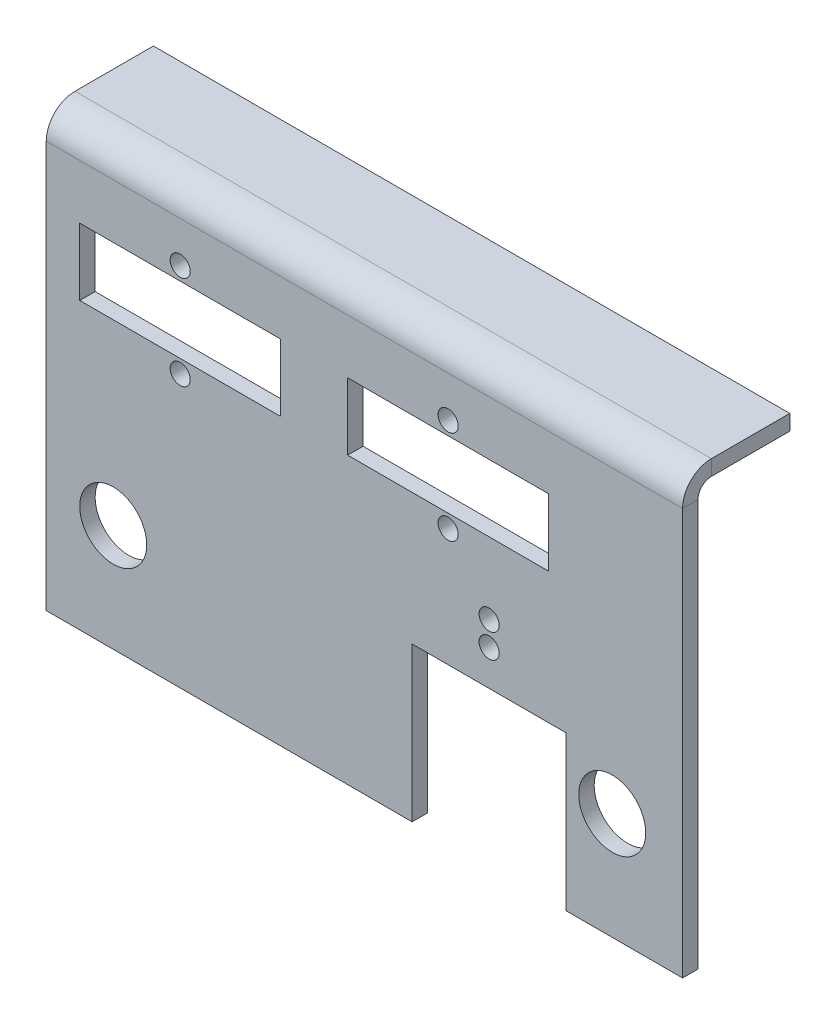
ISO-10303-21;
HEADER;
FILE_DESCRIPTION(('STEP AP214'),'2;1');
FILE_NAME('part.step','',(''),(''),'','','');
FILE_SCHEMA(('AUTOMOTIVE_DESIGN { 1 0 10303 214 1 1 1 1 }'));
ENDSEC;
DATA;
#1=APPLICATION_CONTEXT('core data for automotive mechanical design processes');
#2=APPLICATION_PROTOCOL_DEFINITION('international standard','automotive_design',2000,#1);
#3=PRODUCT_CONTEXT('',#1,'mechanical');
#4=PRODUCT('Part','Part','',(#3));
#5=PRODUCT_RELATED_PRODUCT_CATEGORY('part','',(#4));
#6=PRODUCT_DEFINITION_FORMATION('','',#4);
#7=PRODUCT_DEFINITION_CONTEXT('part definition',#1,'design');
#8=PRODUCT_DEFINITION('design','',#6,#7);
#9=PRODUCT_DEFINITION_SHAPE('','',#8);
#10=(LENGTH_UNIT() NAMED_UNIT(*) SI_UNIT(.MILLI.,.METRE.));
#11=(NAMED_UNIT(*) PLANE_ANGLE_UNIT() SI_UNIT($,.RADIAN.));
#12=(NAMED_UNIT(*) SI_UNIT($,.STERADIAN.) SOLID_ANGLE_UNIT());
#13=UNCERTAINTY_MEASURE_WITH_UNIT(LENGTH_MEASURE(1.E-05),#10,'distance_accuracy_value','');
#14=(GEOMETRIC_REPRESENTATION_CONTEXT(3) GLOBAL_UNCERTAINTY_ASSIGNED_CONTEXT((#13)) GLOBAL_UNIT_ASSIGNED_CONTEXT((#10,
#11,#12)) REPRESENTATION_CONTEXT('',''));
#15=CARTESIAN_POINT('',(0.,0.,0.));
#16=DIRECTION('',(0.,0.,1.));
#17=DIRECTION('',(1.,0.,0.));
#18=AXIS2_PLACEMENT_3D('',#15,#16,#17);
#19=CARTESIAN_POINT('',(0.,0.,-2.3));
#20=DIRECTION('',(0.,-1.,0.));
#21=DIRECTION('',(0.,0.,-1.));
#22=AXIS2_PLACEMENT_3D('',#19,#20,#21);
#23=PLANE('',#22);
#24=DIRECTION('',(0.,0.,1.));
#25=VECTOR('',#24,1.);
#26=CARTESIAN_POINT('',(54.62,0.,-16.001));
#27=LINE('',#26,#25);
#28=CARTESIAN_POINT('',(54.62,0.,-2.3));
#29=VERTEX_POINT('',#28);
#30=CARTESIAN_POINT('',(54.62,0.,0.));
#31=VERTEX_POINT('',#30);
#32=EDGE_CURVE('E292',#29,#31,#27,.T.);
#33=ORIENTED_EDGE('',*,*,#32,.T.);
#34=DIRECTION('',(1.,0.,0.));
#35=VECTOR('',#34,1.);
#36=CARTESIAN_POINT('',(0.,0.,0.));
#37=LINE('',#36,#35);
#38=CARTESIAN_POINT('',(0.,0.,0.));
#39=VERTEX_POINT('',#38);
#40=EDGE_CURVE('E378',#39,#31,#37,.T.);
#41=ORIENTED_EDGE('',*,*,#40,.F.);
#42=DIRECTION('',(0.,0.,1.));
#43=VECTOR('',#42,1.);
#44=CARTESIAN_POINT('',(0.,0.,-2.3));
#45=LINE('',#44,#43);
#46=CARTESIAN_POINT('',(0.,0.,-2.3));
#47=VERTEX_POINT('',#46);
#48=EDGE_CURVE('E65',#47,#39,#45,.T.);
#49=ORIENTED_EDGE('',*,*,#48,.F.);
#50=DIRECTION('',(1.,0.,0.));
#51=VECTOR('',#50,1.);
#52=CARTESIAN_POINT('',(0.,0.,-2.3));
#53=LINE('',#52,#51);
#54=EDGE_CURVE('E370',#47,#29,#53,.T.);
#55=ORIENTED_EDGE('',*,*,#54,.T.);
#56=EDGE_LOOP('',(#33,#41,#49,#55));
#57=FACE_BOUND('',#56,.T.);
#58=ADVANCED_FACE('F61',(#57),#23,.T.);
#59=CARTESIAN_POINT('',(95.,0.,-2.3));
#60=DIRECTION('',(1.,0.,0.));
#61=DIRECTION('',(0.,0.,-1.));
#62=AXIS2_PLACEMENT_3D('',#59,#60,#61);
#63=PLANE('',#62);
#64=DIRECTION('',(0.,1.,0.));
#65=VECTOR('',#64,1.);
#66=CARTESIAN_POINT('',(95.,0.,-2.3));
#67=LINE('',#66,#65);
#68=CARTESIAN_POINT('',(95.,0.,-2.3));
#69=VERTEX_POINT('',#68);
#70=CARTESIAN_POINT('',(95.,60.7,-2.3));
#71=VERTEX_POINT('',#70);
#72=EDGE_CURVE('E373',#69,#71,#67,.T.);
#73=ORIENTED_EDGE('',*,*,#72,.T.);
#74=DIRECTION('',(0.,0.,1.));
#75=VECTOR('',#74,1.);
#76=CARTESIAN_POINT('',(95.,60.7,-2.29999999999999));
#77=LINE('',#76,#75);
#78=CARTESIAN_POINT('',(95.,60.7,0.));
#79=VERTEX_POINT('',#78);
#80=EDGE_CURVE('E350',#71,#79,#77,.T.);
#81=ORIENTED_EDGE('',*,*,#80,.T.);
#82=DIRECTION('',(0.,1.,0.));
#83=VECTOR('',#82,1.);
#84=CARTESIAN_POINT('',(95.,0.,0.));
#85=LINE('',#84,#83);
#86=CARTESIAN_POINT('',(95.,0.,0.));
#87=VERTEX_POINT('',#86);
#88=EDGE_CURVE('E369',#87,#79,#85,.T.);
#89=ORIENTED_EDGE('',*,*,#88,.F.);
#90=DIRECTION('',(0.,0.,1.));
#91=VECTOR('',#90,1.);
#92=CARTESIAN_POINT('',(95.,0.,-2.3));
#93=LINE('',#92,#91);
#94=EDGE_CURVE('E13',#69,#87,#93,.T.);
#95=ORIENTED_EDGE('',*,*,#94,.F.);
#96=EDGE_LOOP('',(#73,#81,#89,#95));
#97=FACE_BOUND('',#96,.T.);
#98=ADVANCED_FACE('F432',(#97),#63,.T.);
#99=CARTESIAN_POINT('',(0.,0.,-2.3));
#100=DIRECTION('',(0.,0.,-1.));
#101=DIRECTION('',(-1.,0.,0.));
#102=AXIS2_PLACEMENT_3D('',#99,#100,#101);
#103=PLANE('',#102);
#104=CARTESIAN_POINT('',(10.,16.,-2.3));
#105=DIRECTION('',(0.,0.,-1.));
#106=DIRECTION('',(-1.,0.,0.));
#107=AXIS2_PLACEMENT_3D('',#104,#105,#106);
#108=CIRCLE('',#107,5.);
#109=CARTESIAN_POINT('',(5.,16.,-2.3));
#110=VERTEX_POINT('',#109);
#111=EDGE_CURVE('E707',#110,#110,#108,.T.);
#112=ORIENTED_EDGE('',*,*,#111,.F.);
#113=EDGE_LOOP('',(#112));
#114=FACE_BOUND('',#113,.T.);
#115=CARTESIAN_POINT('',(84.5,16.,-2.3));
#116=DIRECTION('',(0.,0.,-1.));
#117=DIRECTION('',(-1.,0.,0.));
#118=AXIS2_PLACEMENT_3D('',#115,#116,#117);
#119=CIRCLE('',#118,5.);
#120=CARTESIAN_POINT('',(79.5,16.,-2.3));
#121=VERTEX_POINT('',#120);
#122=EDGE_CURVE('E718',#121,#121,#119,.T.);
#123=ORIENTED_EDGE('',*,*,#122,.F.);
#124=EDGE_LOOP('',(#123));
#125=FACE_BOUND('',#124,.T.);
#126=CARTESIAN_POINT('',(20.,54.6,-2.3));
#127=DIRECTION('',(0.,0.,-1.));
#128=DIRECTION('',(-1.,0.,0.));
#129=AXIS2_PLACEMENT_3D('',#126,#127,#128);
#130=CIRCLE('',#129,1.49999999999994);
#131=CARTESIAN_POINT('',(18.5,54.6,-2.3));
#132=VERTEX_POINT('',#131);
#133=EDGE_CURVE('E725',#132,#132,#130,.T.);
#134=ORIENTED_EDGE('',*,*,#133,.F.);
#135=EDGE_LOOP('',(#134));
#136=FACE_BOUND('',#135,.T.);
#137=CARTESIAN_POINT('',(60.,40.6,-2.3));
#138=DIRECTION('',(0.,0.,-1.));
#139=DIRECTION('',(-1.,0.,0.));
#140=AXIS2_PLACEMENT_3D('',#137,#138,#139);
#141=CIRCLE('',#140,1.5);
#142=CARTESIAN_POINT('',(58.5,40.6,-2.3));
#143=VERTEX_POINT('',#142);
#144=EDGE_CURVE('E726',#143,#143,#141,.T.);
#145=ORIENTED_EDGE('',*,*,#144,.F.);
#146=EDGE_LOOP('',(#145));
#147=FACE_BOUND('',#146,.T.);
#148=CARTESIAN_POINT('',(60.,54.6,-2.3));
#149=DIRECTION('',(0.,0.,-1.));
#150=DIRECTION('',(-1.,0.,0.));
#151=AXIS2_PLACEMENT_3D('',#148,#149,#150);
#152=CIRCLE('',#151,1.5);
#153=CARTESIAN_POINT('',(58.5,54.6,-2.3));
#154=VERTEX_POINT('',#153);
#155=EDGE_CURVE('E238',#154,#154,#152,.T.);
#156=ORIENTED_EDGE('',*,*,#155,.F.);
#157=EDGE_LOOP('',(#156));
#158=FACE_BOUND('',#157,.T.);
#159=DIRECTION('',(0.,-1.,0.));
#160=VECTOR('',#159,1.);
#161=CARTESIAN_POINT('',(75.,52.6,-2.3));
#162=LINE('',#161,#160);
#163=CARTESIAN_POINT('',(75.,52.6,-2.3));
#164=VERTEX_POINT('',#163);
#165=CARTESIAN_POINT('',(75.,42.6,-2.3));
#166=VERTEX_POINT('',#165);
#167=EDGE_CURVE('E76',#164,#166,#162,.T.);
#168=ORIENTED_EDGE('',*,*,#167,.F.);
#169=DIRECTION('',(1.,0.,0.));
#170=VECTOR('',#169,1.);
#171=CARTESIAN_POINT('',(75.,52.6,-2.3));
#172=LINE('',#171,#170);
#173=CARTESIAN_POINT('',(45.,52.6,-2.3));
#174=VERTEX_POINT('',#173);
#175=EDGE_CURVE('E206',#174,#164,#172,.T.);
#176=ORIENTED_EDGE('',*,*,#175,.F.);
#177=DIRECTION('',(0.,1.,0.));
#178=VECTOR('',#177,1.);
#179=CARTESIAN_POINT('',(45.,52.6,-2.3));
#180=LINE('',#179,#178);
#181=CARTESIAN_POINT('',(45.,42.6,-2.3));
#182=VERTEX_POINT('',#181);
#183=EDGE_CURVE('E229',#182,#174,#180,.T.);
#184=ORIENTED_EDGE('',*,*,#183,.F.);
#185=DIRECTION('',(-1.,0.,0.));
#186=VECTOR('',#185,1.);
#187=CARTESIAN_POINT('',(75.,42.6,-2.3));
#188=LINE('',#187,#186);
#189=EDGE_CURVE('E222',#166,#182,#188,.T.);
#190=ORIENTED_EDGE('',*,*,#189,.F.);
#191=EDGE_LOOP('',(#168,#176,#184,#190));
#192=FACE_BOUND('',#191,.T.);
#193=CARTESIAN_POINT('',(20.,40.6,-2.3));
#194=DIRECTION('',(0.,0.,-1.));
#195=DIRECTION('',(-1.,0.,0.));
#196=AXIS2_PLACEMENT_3D('',#193,#194,#195);
#197=CIRCLE('',#196,1.49999999999998);
#198=CARTESIAN_POINT('',(18.5,40.6,-2.3));
#199=VERTEX_POINT('',#198);
#200=EDGE_CURVE('E710',#199,#199,#197,.T.);
#201=ORIENTED_EDGE('',*,*,#200,.F.);
#202=EDGE_LOOP('',(#201));
#203=FACE_BOUND('',#202,.T.);
#204=DIRECTION('',(0.,-1.,0.));
#205=VECTOR('',#204,1.);
#206=CARTESIAN_POINT('',(35.,52.6,-2.3));
#207=LINE('',#206,#205);
#208=CARTESIAN_POINT('',(35.,52.6,-2.3));
#209=VERTEX_POINT('',#208);
#210=CARTESIAN_POINT('',(35.,42.6,-2.3));
#211=VERTEX_POINT('',#210);
#212=EDGE_CURVE('E84',#209,#211,#207,.T.);
#213=ORIENTED_EDGE('',*,*,#212,.F.);
#214=DIRECTION('',(1.,0.,0.));
#215=VECTOR('',#214,1.);
#216=CARTESIAN_POINT('',(35.,52.6,-2.3));
#217=LINE('',#216,#215);
#218=CARTESIAN_POINT('',(5.,52.6,-2.3));
#219=VERTEX_POINT('',#218);
#220=EDGE_CURVE('E259',#219,#209,#217,.T.);
#221=ORIENTED_EDGE('',*,*,#220,.F.);
#222=DIRECTION('',(0.,1.,0.));
#223=VECTOR('',#222,1.);
#224=CARTESIAN_POINT('',(5.,52.6,-2.3));
#225=LINE('',#224,#223);
#226=CARTESIAN_POINT('',(5.,42.6,-2.3));
#227=VERTEX_POINT('',#226);
#228=EDGE_CURVE('E256',#227,#219,#225,.T.);
#229=ORIENTED_EDGE('',*,*,#228,.F.);
#230=DIRECTION('',(-1.,0.,0.));
#231=VECTOR('',#230,1.);
#232=CARTESIAN_POINT('',(35.,42.6,-2.3));
#233=LINE('',#232,#231);
#234=EDGE_CURVE('E253',#211,#227,#233,.T.);
#235=ORIENTED_EDGE('',*,*,#234,.F.);
#236=EDGE_LOOP('',(#213,#221,#229,#235));
#237=FACE_BOUND('',#236,.T.);
#238=DIRECTION('',(0.,-1.,0.));
#239=VECTOR('',#238,1.);
#240=CARTESIAN_POINT('',(54.62,0.,-2.3));
#241=LINE('',#240,#239);
#242=CARTESIAN_POINT('',(54.62,23.,-2.3));
#243=VERTEX_POINT('',#242);
#244=EDGE_CURVE('E281',#243,#29,#241,.T.);
#245=ORIENTED_EDGE('',*,*,#244,.T.);
#246=ORIENTED_EDGE('',*,*,#54,.F.);
#247=DIRECTION('',(0.,-1.,0.));
#248=VECTOR('',#247,1.);
#249=CARTESIAN_POINT('',(0.,0.,-2.3));
#250=LINE('',#249,#248);
#251=CARTESIAN_POINT('',(0.,60.7,-2.3));
#252=VERTEX_POINT('',#251);
#253=EDGE_CURVE('E366',#252,#47,#250,.T.);
#254=ORIENTED_EDGE('',*,*,#253,.F.);
#255=DIRECTION('',(1.,0.,0.));
#256=VECTOR('',#255,1.);
#257=CARTESIAN_POINT('',(95.,60.7,-2.29999999999999));
#258=LINE('',#257,#256);
#259=EDGE_CURVE('E356',#71,#252,#258,.F.);
#260=ORIENTED_EDGE('',*,*,#259,.F.);
#261=ORIENTED_EDGE('',*,*,#72,.F.);
#262=CARTESIAN_POINT('',(77.62,0.,-2.3));
#263=VERTEX_POINT('',#262);
#264=EDGE_CURVE('E368',#263,#69,#53,.T.);
#265=ORIENTED_EDGE('',*,*,#264,.F.);
#266=DIRECTION('',(0.,1.,0.));
#267=VECTOR('',#266,1.);
#268=CARTESIAN_POINT('',(77.62,0.,-2.3));
#269=LINE('',#268,#267);
#270=CARTESIAN_POINT('',(77.62,23.,-2.3));
#271=VERTEX_POINT('',#270);
#272=EDGE_CURVE('E274',#263,#271,#269,.T.);
#273=ORIENTED_EDGE('',*,*,#272,.T.);
#274=DIRECTION('',(-1.,0.,0.));
#275=VECTOR('',#274,1.);
#276=CARTESIAN_POINT('',(54.62,23.,-2.3));
#277=LINE('',#276,#275);
#278=EDGE_CURVE('E277',#271,#243,#277,.T.);
#279=ORIENTED_EDGE('',*,*,#278,.T.);
#280=EDGE_LOOP('',(#245,#246,#254,#260,#261,#265,#273,#279));
#281=FACE_BOUND('',#280,.T.);
#282=CARTESIAN_POINT('',(66.12,28.3,-2.3));
#283=DIRECTION('',(0.,0.,-1.));
#284=DIRECTION('',(-1.,0.,0.));
#285=AXIS2_PLACEMENT_3D('',#282,#283,#284);
#286=CIRCLE('',#285,1.5);
#287=CARTESIAN_POINT('',(64.62,28.3,-2.3));
#288=VERTEX_POINT('',#287);
#289=EDGE_CURVE('E304',#288,#288,#286,.F.);
#290=ORIENTED_EDGE('',*,*,#289,.T.);
#291=EDGE_LOOP('',(#290));
#292=FACE_BOUND('',#291,.T.);
#293=CARTESIAN_POINT('',(66.12,31.9,-2.3));
#294=DIRECTION('',(0.,0.,-1.));
#295=DIRECTION('',(-1.,0.,0.));
#296=AXIS2_PLACEMENT_3D('',#293,#294,#295);
#297=CIRCLE('',#296,1.5);
#298=CARTESIAN_POINT('',(64.62,31.9,-2.3));
#299=VERTEX_POINT('',#298);
#300=EDGE_CURVE('E273',#299,#299,#297,.F.);
#301=ORIENTED_EDGE('',*,*,#300,.T.);
#302=EDGE_LOOP('',(#301));
#303=FACE_BOUND('',#302,.T.);
#304=ADVANCED_FACE('F439',(#114,#125,#136,#147,#158,#192,#203,#237,#281,#292,#303),#103,.T.);
#305=CARTESIAN_POINT('',(0.,0.,0.));
#306=DIRECTION('',(0.,0.,-1.));
#307=DIRECTION('',(-1.,0.,0.));
#308=AXIS2_PLACEMENT_3D('',#305,#306,#307);
#309=PLANE('',#308);
#310=CARTESIAN_POINT('',(10.,16.,0.));
#311=DIRECTION('',(0.,0.,-1.));
#312=DIRECTION('',(-1.,0.,0.));
#313=AXIS2_PLACEMENT_3D('',#310,#311,#312);
#314=CIRCLE('',#313,5.);
#315=CARTESIAN_POINT('',(5.,16.,0.));
#316=VERTEX_POINT('',#315);
#317=EDGE_CURVE('E709',#316,#316,#314,.F.);
#318=ORIENTED_EDGE('',*,*,#317,.F.);
#319=EDGE_LOOP('',(#318));
#320=FACE_BOUND('',#319,.T.);
#321=CARTESIAN_POINT('',(84.5,16.,0.));
#322=DIRECTION('',(0.,0.,-1.));
#323=DIRECTION('',(-1.,0.,0.));
#324=AXIS2_PLACEMENT_3D('',#321,#322,#323);
#325=CIRCLE('',#324,5.);
#326=CARTESIAN_POINT('',(79.5,16.,0.));
#327=VERTEX_POINT('',#326);
#328=EDGE_CURVE('E715',#327,#327,#325,.F.);
#329=ORIENTED_EDGE('',*,*,#328,.F.);
#330=EDGE_LOOP('',(#329));
#331=FACE_BOUND('',#330,.T.);
#332=CARTESIAN_POINT('',(20.,54.6,0.));
#333=DIRECTION('',(0.,0.,-1.));
#334=DIRECTION('',(-1.,0.,0.));
#335=AXIS2_PLACEMENT_3D('',#332,#333,#334);
#336=CIRCLE('',#335,1.49999999999994);
#337=CARTESIAN_POINT('',(18.5,54.6,0.));
#338=VERTEX_POINT('',#337);
#339=EDGE_CURVE('E729',#338,#338,#336,.F.);
#340=ORIENTED_EDGE('',*,*,#339,.F.);
#341=EDGE_LOOP('',(#340));
#342=FACE_BOUND('',#341,.T.);
#343=CARTESIAN_POINT('',(60.,40.6,0.));
#344=DIRECTION('',(0.,0.,-1.));
#345=DIRECTION('',(-1.,0.,0.));
#346=AXIS2_PLACEMENT_3D('',#343,#344,#345);
#347=CIRCLE('',#346,1.5);
#348=CARTESIAN_POINT('',(58.5,40.6,0.));
#349=VERTEX_POINT('',#348);
#350=EDGE_CURVE('E242',#349,#349,#347,.F.);
#351=ORIENTED_EDGE('',*,*,#350,.F.);
#352=EDGE_LOOP('',(#351));
#353=FACE_BOUND('',#352,.T.);
#354=CARTESIAN_POINT('',(60.,54.6,0.));
#355=DIRECTION('',(0.,0.,-1.));
#356=DIRECTION('',(-1.,0.,0.));
#357=AXIS2_PLACEMENT_3D('',#354,#355,#356);
#358=CIRCLE('',#357,1.5);
#359=CARTESIAN_POINT('',(58.5,54.6,0.));
#360=VERTEX_POINT('',#359);
#361=EDGE_CURVE('E241',#360,#360,#358,.F.);
#362=ORIENTED_EDGE('',*,*,#361,.F.);
#363=EDGE_LOOP('',(#362));
#364=FACE_BOUND('',#363,.T.);
#365=DIRECTION('',(-1.,0.,0.));
#366=VECTOR('',#365,1.);
#367=CARTESIAN_POINT('',(75.,52.6,0.));
#368=LINE('',#367,#366);
#369=CARTESIAN_POINT('',(75.,52.6,0.));
#370=VERTEX_POINT('',#369);
#371=CARTESIAN_POINT('',(45.,52.6,0.));
#372=VERTEX_POINT('',#371);
#373=EDGE_CURVE('E220',#370,#372,#368,.T.);
#374=ORIENTED_EDGE('',*,*,#373,.F.);
#375=DIRECTION('',(0.,1.,0.));
#376=VECTOR('',#375,1.);
#377=CARTESIAN_POINT('',(75.,52.6,0.));
#378=LINE('',#377,#376);
#379=CARTESIAN_POINT('',(75.,42.6,0.));
#380=VERTEX_POINT('',#379);
#381=EDGE_CURVE('E200',#380,#370,#378,.T.);
#382=ORIENTED_EDGE('',*,*,#381,.F.);
#383=DIRECTION('',(1.,0.,0.));
#384=VECTOR('',#383,1.);
#385=CARTESIAN_POINT('',(75.,42.6,0.));
#386=LINE('',#385,#384);
#387=CARTESIAN_POINT('',(45.,42.6,0.));
#388=VERTEX_POINT('',#387);
#389=EDGE_CURVE('E210',#388,#380,#386,.T.);
#390=ORIENTED_EDGE('',*,*,#389,.F.);
#391=DIRECTION('',(0.,-1.,0.));
#392=VECTOR('',#391,1.);
#393=CARTESIAN_POINT('',(45.,52.6,0.));
#394=LINE('',#393,#392);
#395=EDGE_CURVE('E224',#372,#388,#394,.T.);
#396=ORIENTED_EDGE('',*,*,#395,.F.);
#397=EDGE_LOOP('',(#374,#382,#390,#396));
#398=FACE_BOUND('',#397,.T.);
#399=CARTESIAN_POINT('',(20.,40.6,0.));
#400=DIRECTION('',(0.,0.,-1.));
#401=DIRECTION('',(-1.,0.,0.));
#402=AXIS2_PLACEMENT_3D('',#399,#400,#401);
#403=CIRCLE('',#402,1.49999999999998);
#404=CARTESIAN_POINT('',(18.5,40.6,0.));
#405=VERTEX_POINT('',#404);
#406=EDGE_CURVE('E713',#405,#405,#403,.F.);
#407=ORIENTED_EDGE('',*,*,#406,.F.);
#408=EDGE_LOOP('',(#407));
#409=FACE_BOUND('',#408,.T.);
#410=DIRECTION('',(-1.,0.,0.));
#411=VECTOR('',#410,1.);
#412=CARTESIAN_POINT('',(35.,52.6,0.));
#413=LINE('',#412,#411);
#414=CARTESIAN_POINT('',(35.,52.6,0.));
#415=VERTEX_POINT('',#414);
#416=CARTESIAN_POINT('',(5.,52.6,0.));
#417=VERTEX_POINT('',#416);
#418=EDGE_CURVE('E246',#415,#417,#413,.T.);
#419=ORIENTED_EDGE('',*,*,#418,.F.);
#420=DIRECTION('',(0.,1.,0.));
#421=VECTOR('',#420,1.);
#422=CARTESIAN_POINT('',(35.,52.6,0.));
#423=LINE('',#422,#421);
#424=CARTESIAN_POINT('',(35.,42.6,0.));
#425=VERTEX_POINT('',#424);
#426=EDGE_CURVE('E249',#425,#415,#423,.T.);
#427=ORIENTED_EDGE('',*,*,#426,.F.);
#428=DIRECTION('',(1.,0.,0.));
#429=VECTOR('',#428,1.);
#430=CARTESIAN_POINT('',(35.,42.6,0.));
#431=LINE('',#430,#429);
#432=CARTESIAN_POINT('',(5.,42.6,0.));
#433=VERTEX_POINT('',#432);
#434=EDGE_CURVE('E265',#433,#425,#431,.T.);
#435=ORIENTED_EDGE('',*,*,#434,.F.);
#436=DIRECTION('',(0.,-1.,0.));
#437=VECTOR('',#436,1.);
#438=CARTESIAN_POINT('',(5.,52.6,0.));
#439=LINE('',#438,#437);
#440=EDGE_CURVE('E214',#417,#433,#439,.T.);
#441=ORIENTED_EDGE('',*,*,#440,.F.);
#442=EDGE_LOOP('',(#419,#427,#435,#441));
#443=FACE_BOUND('',#442,.T.);
#444=CARTESIAN_POINT('',(66.12,28.3,0.));
#445=DIRECTION('',(0.,0.,1.));
#446=DIRECTION('',(1.,0.,0.));
#447=AXIS2_PLACEMENT_3D('',#444,#445,#446);
#448=CIRCLE('',#447,1.5);
#449=CARTESIAN_POINT('',(67.62,28.3,0.));
#450=VERTEX_POINT('',#449);
#451=EDGE_CURVE('E278',#450,#450,#448,.T.);
#452=ORIENTED_EDGE('',*,*,#451,.F.);
#453=EDGE_LOOP('',(#452));
#454=FACE_BOUND('',#453,.T.);
#455=CARTESIAN_POINT('',(66.12,31.9,0.));
#456=DIRECTION('',(0.,0.,1.));
#457=DIRECTION('',(1.,0.,0.));
#458=AXIS2_PLACEMENT_3D('',#455,#456,#457);
#459=CIRCLE('',#458,1.5);
#460=CARTESIAN_POINT('',(67.62,31.9,0.));
#461=VERTEX_POINT('',#460);
#462=EDGE_CURVE('E307',#461,#461,#459,.T.);
#463=ORIENTED_EDGE('',*,*,#462,.F.);
#464=EDGE_LOOP('',(#463));
#465=FACE_BOUND('',#464,.T.);
#466=ORIENTED_EDGE('',*,*,#40,.T.);
#467=DIRECTION('',(0.,-1.,0.));
#468=VECTOR('',#467,1.);
#469=CARTESIAN_POINT('',(54.62,0.,0.));
#470=LINE('',#469,#468);
#471=CARTESIAN_POINT('',(54.62,23.,0.));
#472=VERTEX_POINT('',#471);
#473=EDGE_CURVE('E284',#472,#31,#470,.T.);
#474=ORIENTED_EDGE('',*,*,#473,.F.);
#475=DIRECTION('',(-1.,0.,0.));
#476=VECTOR('',#475,1.);
#477=CARTESIAN_POINT('',(54.62,23.,0.));
#478=LINE('',#477,#476);
#479=CARTESIAN_POINT('',(77.62,23.,0.));
#480=VERTEX_POINT('',#479);
#481=EDGE_CURVE('E289',#480,#472,#478,.T.);
#482=ORIENTED_EDGE('',*,*,#481,.F.);
#483=DIRECTION('',(0.,1.,0.));
#484=VECTOR('',#483,1.);
#485=CARTESIAN_POINT('',(77.62,0.,0.));
#486=LINE('',#485,#484);
#487=CARTESIAN_POINT('',(77.62,0.,0.));
#488=VERTEX_POINT('',#487);
#489=EDGE_CURVE('E286',#488,#480,#486,.T.);
#490=ORIENTED_EDGE('',*,*,#489,.F.);
#491=EDGE_CURVE('E377',#488,#87,#37,.T.);
#492=ORIENTED_EDGE('',*,*,#491,.T.);
#493=ORIENTED_EDGE('',*,*,#88,.T.);
#494=DIRECTION('',(1.,0.,0.));
#495=VECTOR('',#494,1.);
#496=CARTESIAN_POINT('',(95.,60.7,0.));
#497=LINE('',#496,#495);
#498=CARTESIAN_POINT('',(0.,60.7,0.));
#499=VERTEX_POINT('',#498);
#500=EDGE_CURVE('E344',#79,#499,#497,.F.);
#501=ORIENTED_EDGE('',*,*,#500,.T.);
#502=DIRECTION('',(0.,-1.,0.));
#503=VECTOR('',#502,1.);
#504=CARTESIAN_POINT('',(0.,0.,0.));
#505=LINE('',#504,#503);
#506=EDGE_CURVE('E364',#499,#39,#505,.T.);
#507=ORIENTED_EDGE('',*,*,#506,.T.);
#508=EDGE_LOOP('',(#466,#474,#482,#490,#492,#493,#501,#507));
#509=FACE_BOUND('',#508,.T.);
#510=ADVANCED_FACE('F217',(#320,#331,#342,#353,#364,#398,#409,#443,#454,#465,#509),#309,.F.);
#511=CARTESIAN_POINT('',(0.,0.,-2.3));
#512=DIRECTION('',(-1.,0.,0.));
#513=DIRECTION('',(0.,0.,1.));
#514=AXIS2_PLACEMENT_3D('',#511,#512,#513);
#515=PLANE('',#514);
#516=DIRECTION('',(0.,0.,1.));
#517=VECTOR('',#516,1.);
#518=CARTESIAN_POINT('',(0.,60.7,-2.29999999999999));
#519=LINE('',#518,#517);
#520=EDGE_CURVE('E361',#252,#499,#519,.T.);
#521=ORIENTED_EDGE('',*,*,#520,.F.);
#522=ORIENTED_EDGE('',*,*,#253,.T.);
#523=ORIENTED_EDGE('',*,*,#48,.T.);
#524=ORIENTED_EDGE('',*,*,#506,.F.);
#525=EDGE_LOOP('',(#521,#522,#523,#524));
#526=FACE_BOUND('',#525,.T.);
#527=ADVANCED_FACE('F63',(#526),#515,.T.);
#528=DIRECTION('',(0.,0.,1.));
#529=VECTOR('',#528,1.);
#530=CARTESIAN_POINT('',(77.62,0.,-16.001));
#531=LINE('',#530,#529);
#532=EDGE_CURVE('E298',#263,#488,#531,.T.);
#533=ORIENTED_EDGE('',*,*,#532,.F.);
#534=ORIENTED_EDGE('',*,*,#264,.T.);
#535=ORIENTED_EDGE('',*,*,#94,.T.);
#536=ORIENTED_EDGE('',*,*,#491,.F.);
#537=EDGE_LOOP('',(#533,#534,#535,#536));
#538=FACE_BOUND('',#537,.T.);
#539=ADVANCED_FACE('F434',(#538),#23,.T.);
#540=CARTESIAN_POINT('',(0.,60.7,-4.29999999999999));
#541=DIRECTION('',(-1.,0.,0.));
#542=DIRECTION('',(0.,0.,1.));
#543=AXIS2_PLACEMENT_3D('',#540,#541,#542);
#544=PLANE('',#543);
#545=DIRECTION('',(0.,1.,0.));
#546=VECTOR('',#545,1.);
#547=CARTESIAN_POINT('',(0.,65.,-4.29999999999998));
#548=LINE('',#547,#546);
#549=CARTESIAN_POINT('',(0.,62.7,-4.29999999999998));
#550=VERTEX_POINT('',#549);
#551=CARTESIAN_POINT('',(0.,65.,-4.29999999999998));
#552=VERTEX_POINT('',#551);
#553=EDGE_CURVE('E295',#550,#552,#548,.T.);
#554=ORIENTED_EDGE('',*,*,#553,.F.);
#555=CARTESIAN_POINT('',(0.,60.7,-4.29999999999999));
#556=DIRECTION('',(1.,0.,0.));
#557=DIRECTION('',(0.,0.,-1.));
#558=AXIS2_PLACEMENT_3D('',#555,#556,#557);
#559=CIRCLE('',#558,2.);
#560=EDGE_CURVE('E353',#252,#550,#559,.F.);
#561=ORIENTED_EDGE('',*,*,#560,.F.);
#562=ORIENTED_EDGE('',*,*,#520,.T.);
#563=CARTESIAN_POINT('',(0.,60.7,-4.29999999999999));
#564=DIRECTION('',(1.,0.,0.));
#565=DIRECTION('',(0.,0.,-1.));
#566=AXIS2_PLACEMENT_3D('',#563,#564,#565);
#567=CIRCLE('',#566,4.3);
#568=EDGE_CURVE('E346',#499,#552,#567,.F.);
#569=ORIENTED_EDGE('',*,*,#568,.T.);
#570=EDGE_LOOP('',(#554,#561,#562,#569));
#571=FACE_BOUND('',#570,.T.);
#572=ADVANCED_FACE('F415',(#571),#544,.T.);
#573=CARTESIAN_POINT('',(95.,60.7,-4.29999999999999));
#574=DIRECTION('',(-1.,0.,0.));
#575=DIRECTION('',(0.,0.,1.));
#576=AXIS2_PLACEMENT_3D('',#573,#574,#575);
#577=PLANE('',#576);
#578=CARTESIAN_POINT('',(95.,60.7,-4.29999999999999));
#579=DIRECTION('',(1.,0.,0.));
#580=DIRECTION('',(0.,0.,-1.));
#581=AXIS2_PLACEMENT_3D('',#578,#579,#580);
#582=CIRCLE('',#581,2.);
#583=CARTESIAN_POINT('',(95.,62.7,-4.29999999999998));
#584=VERTEX_POINT('',#583);
#585=EDGE_CURVE('E314',#584,#71,#582,.T.);
#586=ORIENTED_EDGE('',*,*,#585,.F.);
#587=DIRECTION('',(0.,1.,0.));
#588=VECTOR('',#587,1.);
#589=CARTESIAN_POINT('',(95.,62.7,-4.29999999999998));
#590=LINE('',#589,#588);
#591=CARTESIAN_POINT('',(95.,65.,-4.29999999999998));
#592=VERTEX_POINT('',#591);
#593=EDGE_CURVE('E337',#584,#592,#590,.T.);
#594=ORIENTED_EDGE('',*,*,#593,.T.);
#595=CARTESIAN_POINT('',(95.,60.7,-4.29999999999999));
#596=DIRECTION('',(1.,0.,0.));
#597=DIRECTION('',(0.,0.,-1.));
#598=AXIS2_PLACEMENT_3D('',#595,#596,#597);
#599=CIRCLE('',#598,4.3);
#600=EDGE_CURVE('E347',#592,#79,#599,.T.);
#601=ORIENTED_EDGE('',*,*,#600,.T.);
#602=ORIENTED_EDGE('',*,*,#80,.F.);
#603=EDGE_LOOP('',(#586,#594,#601,#602));
#604=FACE_BOUND('',#603,.T.);
#605=ADVANCED_FACE('F396',(#604),#577,.F.);
#606=CARTESIAN_POINT('',(95.,60.7,-4.29999999999999));
#607=DIRECTION('',(1.,0.,0.));
#608=DIRECTION('',(0.,1.,0.));
#609=AXIS2_PLACEMENT_3D('',#606,#607,#608);
#610=CYLINDRICAL_SURFACE('',#609,4.3);
#611=ORIENTED_EDGE('',*,*,#500,.F.);
#612=ORIENTED_EDGE('',*,*,#600,.F.);
#613=DIRECTION('',(1.,0.,0.));
#614=VECTOR('',#613,1.);
#615=CARTESIAN_POINT('',(0.,65.,-4.29999999999998));
#616=LINE('',#615,#614);
#617=EDGE_CURVE('E334',#552,#592,#616,.T.);
#618=ORIENTED_EDGE('',*,*,#617,.F.);
#619=ORIENTED_EDGE('',*,*,#568,.F.);
#620=EDGE_LOOP('',(#611,#612,#618,#619));
#621=FACE_BOUND('',#620,.T.);
#622=ADVANCED_FACE('F392',(#621),#610,.T.);
#623=CARTESIAN_POINT('',(95.,60.7,-4.29999999999999));
#624=DIRECTION('',(1.,0.,0.));
#625=DIRECTION('',(0.,1.,0.));
#626=AXIS2_PLACEMENT_3D('',#623,#624,#625);
#627=CYLINDRICAL_SURFACE('',#626,2.);
#628=ORIENTED_EDGE('',*,*,#259,.T.);
#629=ORIENTED_EDGE('',*,*,#560,.T.);
#630=DIRECTION('',(-1.,0.,0.));
#631=VECTOR('',#630,1.);
#632=CARTESIAN_POINT('',(0.,62.7,-4.29999999999998));
#633=LINE('',#632,#631);
#634=EDGE_CURVE('E340',#550,#584,#633,.F.);
#635=ORIENTED_EDGE('',*,*,#634,.T.);
#636=ORIENTED_EDGE('',*,*,#585,.T.);
#637=EDGE_LOOP('',(#628,#629,#635,#636));
#638=FACE_BOUND('',#637,.T.);
#639=ADVANCED_FACE('F418',(#638),#627,.F.);
#640=CARTESIAN_POINT('',(95.,65.,-2.29999999999999));
#641=DIRECTION('',(1.,0.,0.));
#642=DIRECTION('',(0.,0.,-1.));
#643=AXIS2_PLACEMENT_3D('',#640,#641,#642);
#644=PLANE('',#643);
#645=DIRECTION('',(0.,0.,1.));
#646=VECTOR('',#645,1.);
#647=CARTESIAN_POINT('',(95.,65.,-2.29999999999999));
#648=LINE('',#647,#646);
#649=CARTESIAN_POINT('',(95.,65.,-16.));
#650=VERTEX_POINT('',#649);
#651=EDGE_CURVE('E318',#650,#592,#648,.T.);
#652=ORIENTED_EDGE('',*,*,#651,.T.);
#653=ORIENTED_EDGE('',*,*,#593,.F.);
#654=DIRECTION('',(0.,0.,-1.));
#655=VECTOR('',#654,1.);
#656=CARTESIAN_POINT('',(95.,62.7,1.975305563886E-13));
#657=LINE('',#656,#655);
#658=CARTESIAN_POINT('',(95.,62.7,-16.));
#659=VERTEX_POINT('',#658);
#660=EDGE_CURVE('E326',#659,#584,#657,.F.);
#661=ORIENTED_EDGE('',*,*,#660,.F.);
#662=DIRECTION('',(0.,-1.,0.));
#663=VECTOR('',#662,1.);
#664=CARTESIAN_POINT('',(95.,65.,-16.));
#665=LINE('',#664,#663);
#666=EDGE_CURVE('E312',#650,#659,#665,.T.);
#667=ORIENTED_EDGE('',*,*,#666,.F.);
#668=EDGE_LOOP('',(#652,#653,#661,#667));
#669=FACE_BOUND('',#668,.T.);
#670=ADVANCED_FACE('F405',(#669),#644,.T.);
#671=CARTESIAN_POINT('',(0.,65.,-16.));
#672=DIRECTION('',(-1.,0.,0.));
#673=DIRECTION('',(0.,0.,1.));
#674=AXIS2_PLACEMENT_3D('',#671,#672,#673);
#675=PLANE('',#674);
#676=DIRECTION('',(0.,0.,1.));
#677=VECTOR('',#676,1.);
#678=CARTESIAN_POINT('',(0.,62.7,1.975305563886E-13));
#679=LINE('',#678,#677);
#680=CARTESIAN_POINT('',(0.,62.7,-16.));
#681=VERTEX_POINT('',#680);
#682=EDGE_CURVE('E332',#550,#681,#679,.F.);
#683=ORIENTED_EDGE('',*,*,#682,.F.);
#684=ORIENTED_EDGE('',*,*,#553,.T.);
#685=DIRECTION('',(0.,0.,-1.));
#686=VECTOR('',#685,1.);
#687=CARTESIAN_POINT('',(0.,65.,-16.));
#688=LINE('',#687,#686);
#689=CARTESIAN_POINT('',(0.,65.,-16.));
#690=VERTEX_POINT('',#689);
#691=EDGE_CURVE('E324',#552,#690,#688,.T.);
#692=ORIENTED_EDGE('',*,*,#691,.T.);
#693=DIRECTION('',(0.,-1.,0.));
#694=VECTOR('',#693,1.);
#695=CARTESIAN_POINT('',(0.,65.,-16.));
#696=LINE('',#695,#694);
#697=EDGE_CURVE('E315',#690,#681,#696,.T.);
#698=ORIENTED_EDGE('',*,*,#697,.T.);
#699=EDGE_LOOP('',(#683,#684,#692,#698));
#700=FACE_BOUND('',#699,.T.);
#701=ADVANCED_FACE('F412',(#700),#675,.T.);
#702=CARTESIAN_POINT('',(0.,65.,2.05560963467939E-13));
#703=DIRECTION('',(0.,1.,0.));
#704=DIRECTION('',(0.,0.,1.));
#705=AXIS2_PLACEMENT_3D('',#702,#703,#704);
#706=PLANE('',#705);
#707=ORIENTED_EDGE('',*,*,#691,.F.);
#708=ORIENTED_EDGE('',*,*,#617,.T.);
#709=ORIENTED_EDGE('',*,*,#651,.F.);
#710=DIRECTION('',(1.,0.,0.));
#711=VECTOR('',#710,1.);
#712=CARTESIAN_POINT('',(95.,65.,-16.));
#713=LINE('',#712,#711);
#714=EDGE_CURVE('E321',#690,#650,#713,.T.);
#715=ORIENTED_EDGE('',*,*,#714,.F.);
#716=EDGE_LOOP('',(#707,#708,#709,#715));
#717=FACE_BOUND('',#716,.T.);
#718=ADVANCED_FACE('F403',(#717),#706,.T.);
#719=CARTESIAN_POINT('',(0.,62.7,1.975305563886E-13));
#720=DIRECTION('',(0.,1.,0.));
#721=DIRECTION('',(0.,0.,1.));
#722=AXIS2_PLACEMENT_3D('',#719,#720,#721);
#723=PLANE('',#722);
#724=ORIENTED_EDGE('',*,*,#634,.F.);
#725=ORIENTED_EDGE('',*,*,#682,.T.);
#726=DIRECTION('',(-1.,0.,0.));
#727=VECTOR('',#726,1.);
#728=CARTESIAN_POINT('',(0.,62.7,-16.));
#729=LINE('',#728,#727);
#730=EDGE_CURVE('E329',#681,#659,#729,.F.);
#731=ORIENTED_EDGE('',*,*,#730,.T.);
#732=ORIENTED_EDGE('',*,*,#660,.T.);
#733=EDGE_LOOP('',(#724,#725,#731,#732));
#734=FACE_BOUND('',#733,.T.);
#735=ADVANCED_FACE('F420',(#734),#723,.F.);
#736=CARTESIAN_POINT('',(95.,65.,-16.));
#737=DIRECTION('',(0.,0.,-1.));
#738=DIRECTION('',(0.,1.,0.));
#739=AXIS2_PLACEMENT_3D('',#736,#737,#738);
#740=PLANE('',#739);
#741=ORIENTED_EDGE('',*,*,#730,.F.);
#742=ORIENTED_EDGE('',*,*,#697,.F.);
#743=ORIENTED_EDGE('',*,*,#714,.T.);
#744=ORIENTED_EDGE('',*,*,#666,.T.);
#745=EDGE_LOOP('',(#741,#742,#743,#744));
#746=FACE_BOUND('',#745,.T.);
#747=ADVANCED_FACE('F409',(#746),#740,.T.);
#748=CARTESIAN_POINT('',(54.62,0.,-16.001));
#749=DIRECTION('',(-1.,0.,0.));
#750=DIRECTION('',(0.,-1.,0.));
#751=AXIS2_PLACEMENT_3D('',#748,#749,#750);
#752=PLANE('',#751);
#753=DIRECTION('',(0.,0.,1.));
#754=VECTOR('',#753,1.);
#755=CARTESIAN_POINT('',(54.62,23.,-16.001));
#756=LINE('',#755,#754);
#757=EDGE_CURVE('E293',#243,#472,#756,.T.);
#758=ORIENTED_EDGE('',*,*,#757,.T.);
#759=ORIENTED_EDGE('',*,*,#473,.T.);
#760=ORIENTED_EDGE('',*,*,#32,.F.);
#761=ORIENTED_EDGE('',*,*,#244,.F.);
#762=EDGE_LOOP('',(#758,#759,#760,#761));
#763=FACE_BOUND('',#762,.T.);
#764=ADVANCED_FACE('F427',(#763),#752,.F.);
#765=CARTESIAN_POINT('',(54.62,23.,-16.001));
#766=DIRECTION('',(0.,1.,0.));
#767=DIRECTION('',(0.,0.,1.));
#768=AXIS2_PLACEMENT_3D('',#765,#766,#767);
#769=PLANE('',#768);
#770=DIRECTION('',(0.,0.,1.));
#771=VECTOR('',#770,1.);
#772=CARTESIAN_POINT('',(77.62,23.,-16.001));
#773=LINE('',#772,#771);
#774=EDGE_CURVE('E296',#271,#480,#773,.T.);
#775=ORIENTED_EDGE('',*,*,#774,.T.);
#776=ORIENTED_EDGE('',*,*,#481,.T.);
#777=ORIENTED_EDGE('',*,*,#757,.F.);
#778=ORIENTED_EDGE('',*,*,#278,.F.);
#779=EDGE_LOOP('',(#775,#776,#777,#778));
#780=FACE_BOUND('',#779,.T.);
#781=ADVANCED_FACE('F465',(#780),#769,.F.);
#782=CARTESIAN_POINT('',(77.62,0.,-16.001));
#783=DIRECTION('',(1.,0.,0.));
#784=DIRECTION('',(0.,0.,-1.));
#785=AXIS2_PLACEMENT_3D('',#782,#783,#784);
#786=PLANE('',#785);
#787=ORIENTED_EDGE('',*,*,#532,.T.);
#788=ORIENTED_EDGE('',*,*,#489,.T.);
#789=ORIENTED_EDGE('',*,*,#774,.F.);
#790=ORIENTED_EDGE('',*,*,#272,.F.);
#791=EDGE_LOOP('',(#787,#788,#789,#790));
#792=FACE_BOUND('',#791,.T.);
#793=ADVANCED_FACE('F467',(#792),#786,.F.);
#794=CARTESIAN_POINT('',(66.12,31.9,-16.001));
#795=DIRECTION('',(0.,0.,1.));
#796=DIRECTION('',(1.,0.,0.));
#797=AXIS2_PLACEMENT_3D('',#794,#795,#796);
#798=CYLINDRICAL_SURFACE('',#797,1.5);
#799=ORIENTED_EDGE('',*,*,#300,.F.);
#800=EDGE_LOOP('',(#799));
#801=FACE_BOUND('',#800,.T.);
#802=ORIENTED_EDGE('',*,*,#462,.T.);
#803=EDGE_LOOP('',(#802));
#804=FACE_BOUND('',#803,.T.);
#805=ADVANCED_FACE('F469',(#801,#804),#798,.F.);
#806=CARTESIAN_POINT('',(66.12,28.3,-16.001));
#807=DIRECTION('',(0.,0.,1.));
#808=DIRECTION('',(1.,0.,0.));
#809=AXIS2_PLACEMENT_3D('',#806,#807,#808);
#810=CYLINDRICAL_SURFACE('',#809,1.5);
#811=ORIENTED_EDGE('',*,*,#289,.F.);
#812=EDGE_LOOP('',(#811));
#813=FACE_BOUND('',#812,.T.);
#814=ORIENTED_EDGE('',*,*,#451,.T.);
#815=EDGE_LOOP('',(#814));
#816=FACE_BOUND('',#815,.T.);
#817=ADVANCED_FACE('F475',(#813,#816),#810,.F.);
#818=CARTESIAN_POINT('',(35.,52.6,0.00100000000001141));
#819=DIRECTION('',(1.,0.,0.));
#820=DIRECTION('',(0.,0.,-1.));
#821=AXIS2_PLACEMENT_3D('',#818,#819,#820);
#822=PLANE('',#821);
#823=ORIENTED_EDGE('',*,*,#426,.T.);
#824=DIRECTION('',(0.,0.,-1.));
#825=VECTOR('',#824,1.);
#826=CARTESIAN_POINT('',(35.,52.6,0.00100000000001141));
#827=LINE('',#826,#825);
#828=EDGE_CURVE('E263',#415,#209,#827,.T.);
#829=ORIENTED_EDGE('',*,*,#828,.T.);
#830=ORIENTED_EDGE('',*,*,#212,.T.);
#831=DIRECTION('',(0.,0.,-1.));
#832=VECTOR('',#831,1.);
#833=CARTESIAN_POINT('',(35.,42.6,0.00100000000001141));
#834=LINE('',#833,#832);
#835=EDGE_CURVE('E262',#425,#211,#834,.T.);
#836=ORIENTED_EDGE('',*,*,#835,.F.);
#837=EDGE_LOOP('',(#823,#829,#830,#836));
#838=FACE_BOUND('',#837,.T.);
#839=ADVANCED_FACE('F483',(#838),#822,.F.);
#840=CARTESIAN_POINT('',(35.,52.6,0.00100000000001141));
#841=DIRECTION('',(0.,1.,0.));
#842=DIRECTION('',(0.,0.,1.));
#843=AXIS2_PLACEMENT_3D('',#840,#841,#842);
#844=PLANE('',#843);
#845=ORIENTED_EDGE('',*,*,#418,.T.);
#846=DIRECTION('',(0.,0.,-1.));
#847=VECTOR('',#846,1.);
#848=CARTESIAN_POINT('',(5.,52.6,0.00100000000001141));
#849=LINE('',#848,#847);
#850=EDGE_CURVE('E266',#417,#219,#849,.T.);
#851=ORIENTED_EDGE('',*,*,#850,.T.);
#852=ORIENTED_EDGE('',*,*,#220,.T.);
#853=ORIENTED_EDGE('',*,*,#828,.F.);
#854=EDGE_LOOP('',(#845,#851,#852,#853));
#855=FACE_BOUND('',#854,.T.);
#856=ADVANCED_FACE('F488',(#855),#844,.F.);
#857=CARTESIAN_POINT('',(5.,52.6,0.00100000000001141));
#858=DIRECTION('',(-1.,0.,0.));
#859=DIRECTION('',(0.,-1.,0.));
#860=AXIS2_PLACEMENT_3D('',#857,#858,#859);
#861=PLANE('',#860);
#862=ORIENTED_EDGE('',*,*,#440,.T.);
#863=DIRECTION('',(0.,0.,-1.));
#864=VECTOR('',#863,1.);
#865=CARTESIAN_POINT('',(5.,42.6,0.00100000000001141));
#866=LINE('',#865,#864);
#867=EDGE_CURVE('E268',#433,#227,#866,.T.);
#868=ORIENTED_EDGE('',*,*,#867,.T.);
#869=ORIENTED_EDGE('',*,*,#228,.T.);
#870=ORIENTED_EDGE('',*,*,#850,.F.);
#871=EDGE_LOOP('',(#862,#868,#869,#870));
#872=FACE_BOUND('',#871,.T.);
#873=ADVANCED_FACE('F586',(#872),#861,.F.);
#874=CARTESIAN_POINT('',(35.,42.6,0.00100000000001141));
#875=DIRECTION('',(0.,-1.,0.));
#876=DIRECTION('',(0.,0.,-1.));
#877=AXIS2_PLACEMENT_3D('',#874,#875,#876);
#878=PLANE('',#877);
#879=ORIENTED_EDGE('',*,*,#434,.T.);
#880=ORIENTED_EDGE('',*,*,#835,.T.);
#881=ORIENTED_EDGE('',*,*,#234,.T.);
#882=ORIENTED_EDGE('',*,*,#867,.F.);
#883=EDGE_LOOP('',(#879,#880,#881,#882));
#884=FACE_BOUND('',#883,.T.);
#885=ADVANCED_FACE('F596',(#884),#878,.F.);
#886=CARTESIAN_POINT('',(20.,40.6,0.00100000000001141));
#887=DIRECTION('',(0.,0.,-1.));
#888=DIRECTION('',(-1.,0.,0.));
#889=AXIS2_PLACEMENT_3D('',#886,#887,#888);
#890=CYLINDRICAL_SURFACE('',#889,1.49999999999998);
#891=ORIENTED_EDGE('',*,*,#200,.T.);
#892=EDGE_LOOP('',(#891));
#893=FACE_BOUND('',#892,.T.);
#894=ORIENTED_EDGE('',*,*,#406,.T.);
#895=EDGE_LOOP('',(#894));
#896=FACE_BOUND('',#895,.T.);
#897=ADVANCED_FACE('F606',(#893,#896),#890,.F.);
#898=CARTESIAN_POINT('',(75.,52.6,0.00100000000001141));
#899=DIRECTION('',(1.,0.,0.));
#900=DIRECTION('',(0.,0.,-1.));
#901=AXIS2_PLACEMENT_3D('',#898,#899,#900);
#902=PLANE('',#901);
#903=ORIENTED_EDGE('',*,*,#381,.T.);
#904=DIRECTION('',(0.,0.,-1.));
#905=VECTOR('',#904,1.);
#906=CARTESIAN_POINT('',(75.,52.6,0.00100000000001141));
#907=LINE('',#906,#905);
#908=EDGE_CURVE('E215',#370,#164,#907,.T.);
#909=ORIENTED_EDGE('',*,*,#908,.T.);
#910=ORIENTED_EDGE('',*,*,#167,.T.);
#911=DIRECTION('',(0.,0.,-1.));
#912=VECTOR('',#911,1.);
#913=CARTESIAN_POINT('',(75.,42.6,0.00100000000001141));
#914=LINE('',#913,#912);
#915=EDGE_CURVE('E196',#380,#166,#914,.T.);
#916=ORIENTED_EDGE('',*,*,#915,.F.);
#917=EDGE_LOOP('',(#903,#909,#910,#916));
#918=FACE_BOUND('',#917,.T.);
#919=ADVANCED_FACE('F198',(#918),#902,.F.);
#920=CARTESIAN_POINT('',(75.,52.6,0.00100000000001141));
#921=DIRECTION('',(0.,1.,0.));
#922=DIRECTION('',(0.,0.,1.));
#923=AXIS2_PLACEMENT_3D('',#920,#921,#922);
#924=PLANE('',#923);
#925=ORIENTED_EDGE('',*,*,#373,.T.);
#926=DIRECTION('',(0.,0.,-1.));
#927=VECTOR('',#926,1.);
#928=CARTESIAN_POINT('',(45.,52.6,0.00100000000001141));
#929=LINE('',#928,#927);
#930=EDGE_CURVE('E235',#372,#174,#929,.T.);
#931=ORIENTED_EDGE('',*,*,#930,.T.);
#932=ORIENTED_EDGE('',*,*,#175,.T.);
#933=ORIENTED_EDGE('',*,*,#908,.F.);
#934=EDGE_LOOP('',(#925,#931,#932,#933));
#935=FACE_BOUND('',#934,.T.);
#936=ADVANCED_FACE('F625',(#935),#924,.F.);
#937=CARTESIAN_POINT('',(45.,52.6,0.00100000000001141));
#938=DIRECTION('',(-1.,0.,0.));
#939=DIRECTION('',(0.,0.,1.));
#940=AXIS2_PLACEMENT_3D('',#937,#938,#939);
#941=PLANE('',#940);
#942=ORIENTED_EDGE('',*,*,#395,.T.);
#943=DIRECTION('',(0.,0.,-1.));
#944=VECTOR('',#943,1.);
#945=CARTESIAN_POINT('',(45.,42.6,0.00100000000001141));
#946=LINE('',#945,#944);
#947=EDGE_CURVE('E205',#388,#182,#946,.T.);
#948=ORIENTED_EDGE('',*,*,#947,.T.);
#949=ORIENTED_EDGE('',*,*,#183,.T.);
#950=ORIENTED_EDGE('',*,*,#930,.F.);
#951=EDGE_LOOP('',(#942,#948,#949,#950));
#952=FACE_BOUND('',#951,.T.);
#953=ADVANCED_FACE('F634',(#952),#941,.F.);
#954=CARTESIAN_POINT('',(75.,42.6,0.00100000000001141));
#955=DIRECTION('',(0.,-1.,0.));
#956=DIRECTION('',(0.,0.,-1.));
#957=AXIS2_PLACEMENT_3D('',#954,#955,#956);
#958=PLANE('',#957);
#959=ORIENTED_EDGE('',*,*,#389,.T.);
#960=ORIENTED_EDGE('',*,*,#915,.T.);
#961=ORIENTED_EDGE('',*,*,#189,.T.);
#962=ORIENTED_EDGE('',*,*,#947,.F.);
#963=EDGE_LOOP('',(#959,#960,#961,#962));
#964=FACE_BOUND('',#963,.T.);
#965=ADVANCED_FACE('F211',(#964),#958,.F.);
#966=CARTESIAN_POINT('',(60.,54.6,0.00100000000001141));
#967=DIRECTION('',(0.,0.,-1.));
#968=DIRECTION('',(-1.,0.,0.));
#969=AXIS2_PLACEMENT_3D('',#966,#967,#968);
#970=CYLINDRICAL_SURFACE('',#969,1.5);
#971=ORIENTED_EDGE('',*,*,#155,.T.);
#972=EDGE_LOOP('',(#971));
#973=FACE_BOUND('',#972,.T.);
#974=ORIENTED_EDGE('',*,*,#361,.T.);
#975=EDGE_LOOP('',(#974));
#976=FACE_BOUND('',#975,.T.);
#977=ADVANCED_FACE('F653',(#973,#976),#970,.F.);
#978=CARTESIAN_POINT('',(60.,40.6,0.00100000000001141));
#979=DIRECTION('',(0.,0.,-1.));
#980=DIRECTION('',(-1.,0.,0.));
#981=AXIS2_PLACEMENT_3D('',#978,#979,#980);
#982=CYLINDRICAL_SURFACE('',#981,1.5);
#983=ORIENTED_EDGE('',*,*,#144,.T.);
#984=EDGE_LOOP('',(#983));
#985=FACE_BOUND('',#984,.T.);
#986=ORIENTED_EDGE('',*,*,#350,.T.);
#987=EDGE_LOOP('',(#986));
#988=FACE_BOUND('',#987,.T.);
#989=ADVANCED_FACE('F662',(#985,#988),#982,.F.);
#990=CARTESIAN_POINT('',(20.,54.6,0.00100000000001141));
#991=DIRECTION('',(0.,0.,-1.));
#992=DIRECTION('',(-1.,0.,0.));
#993=AXIS2_PLACEMENT_3D('',#990,#991,#992);
#994=CYLINDRICAL_SURFACE('',#993,1.49999999999994);
#995=ORIENTED_EDGE('',*,*,#133,.T.);
#996=EDGE_LOOP('',(#995));
#997=FACE_BOUND('',#996,.T.);
#998=ORIENTED_EDGE('',*,*,#339,.T.);
#999=EDGE_LOOP('',(#998));
#1000=FACE_BOUND('',#999,.T.);
#1001=ADVANCED_FACE('F672',(#997,#1000),#994,.F.);
#1002=CARTESIAN_POINT('',(84.5,16.,0.00100000000001141));
#1003=DIRECTION('',(0.,0.,-1.));
#1004=DIRECTION('',(-1.,0.,0.));
#1005=AXIS2_PLACEMENT_3D('',#1002,#1003,#1004);
#1006=CYLINDRICAL_SURFACE('',#1005,5.);
#1007=ORIENTED_EDGE('',*,*,#122,.T.);
#1008=EDGE_LOOP('',(#1007));
#1009=FACE_BOUND('',#1008,.T.);
#1010=ORIENTED_EDGE('',*,*,#328,.T.);
#1011=EDGE_LOOP('',(#1010));
#1012=FACE_BOUND('',#1011,.T.);
#1013=ADVANCED_FACE('F682',(#1009,#1012),#1006,.F.);
#1014=CARTESIAN_POINT('',(10.,16.,0.00100000000001141));
#1015=DIRECTION('',(0.,0.,-1.));
#1016=DIRECTION('',(-1.,0.,0.));
#1017=AXIS2_PLACEMENT_3D('',#1014,#1015,#1016);
#1018=CYLINDRICAL_SURFACE('',#1017,5.);
#1019=ORIENTED_EDGE('',*,*,#111,.T.);
#1020=EDGE_LOOP('',(#1019));
#1021=FACE_BOUND('',#1020,.T.);
#1022=ORIENTED_EDGE('',*,*,#317,.T.);
#1023=EDGE_LOOP('',(#1022));
#1024=FACE_BOUND('',#1023,.T.);
#1025=ADVANCED_FACE('F691',(#1021,#1024),#1018,.F.);
#1026=CLOSED_SHELL('',(#58,#98,#304,#510,#527,#539,#572,#605,#622,#639,#670,#701,#718,#735,#747,
#764,#781,#793,#805,#817,#839,#856,#873,#885,#897,#919,#936,#953,#965,#977,#989,#1001,#1013,#1025));
#1027=MANIFOLD_SOLID_BREP('B2',#1026);
#1028=ADVANCED_BREP_SHAPE_REPRESENTATION('',(#18,#1027),#14);
#1029=SHAPE_DEFINITION_REPRESENTATION(#9,#1028);
ENDSEC;
END-ISO-10303-21;
